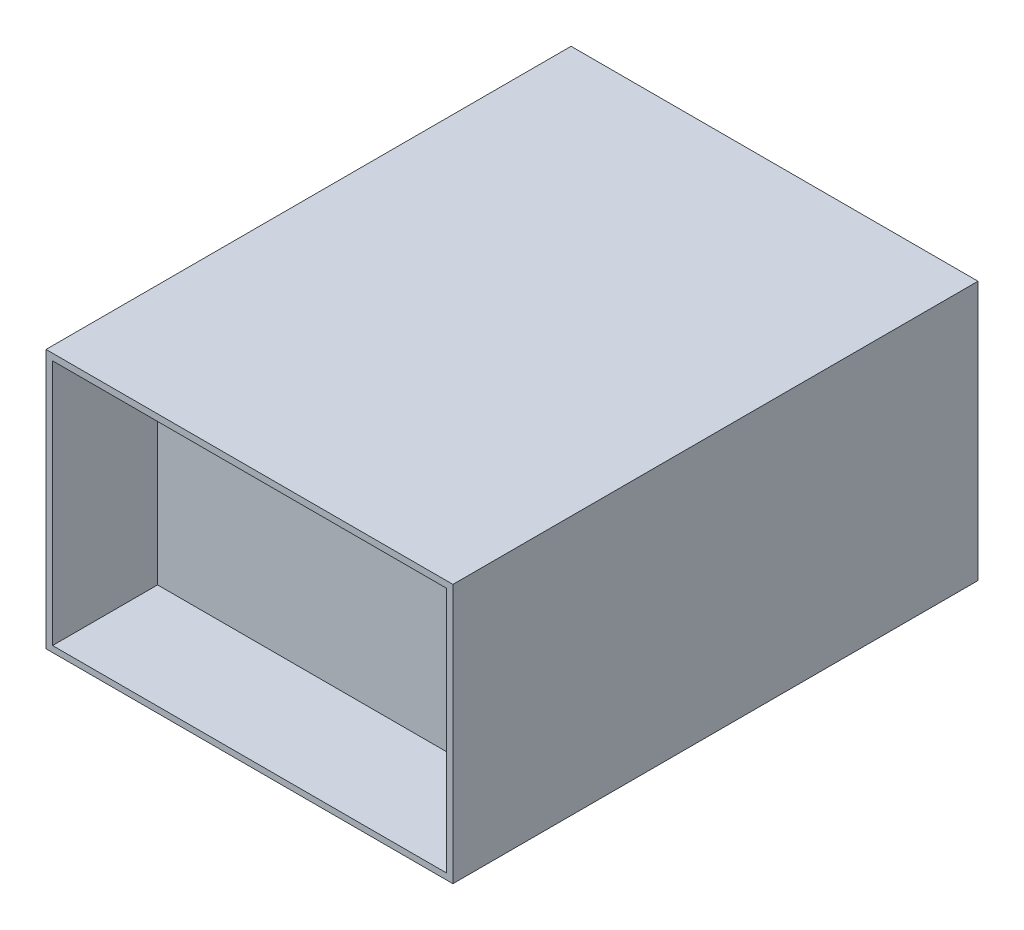
ISO-10303-21;
HEADER;
FILE_DESCRIPTION(('STEP AP214'),'2;1');
FILE_NAME('part.step','',(''),(''),'','','');
FILE_SCHEMA(('AUTOMOTIVE_DESIGN { 1 0 10303 214 1 1 1 1 }'));
ENDSEC;
DATA;
#1=APPLICATION_CONTEXT('core data for automotive mechanical design processes');
#2=APPLICATION_PROTOCOL_DEFINITION('international standard','automotive_design',2000,#1);
#3=PRODUCT_CONTEXT('',#1,'mechanical');
#4=PRODUCT('Part','Part','',(#3));
#5=PRODUCT_RELATED_PRODUCT_CATEGORY('part','',(#4));
#6=PRODUCT_DEFINITION_FORMATION('','',#4);
#7=PRODUCT_DEFINITION_CONTEXT('part definition',#1,'design');
#8=PRODUCT_DEFINITION('design','',#6,#7);
#9=PRODUCT_DEFINITION_SHAPE('','',#8);
#10=(LENGTH_UNIT() NAMED_UNIT(*) SI_UNIT(.MILLI.,.METRE.));
#11=(NAMED_UNIT(*) PLANE_ANGLE_UNIT() SI_UNIT($,.RADIAN.));
#12=(NAMED_UNIT(*) SI_UNIT($,.STERADIAN.) SOLID_ANGLE_UNIT());
#13=UNCERTAINTY_MEASURE_WITH_UNIT(LENGTH_MEASURE(1.E-05),#10,'distance_accuracy_value','');
#14=(GEOMETRIC_REPRESENTATION_CONTEXT(3) GLOBAL_UNCERTAINTY_ASSIGNED_CONTEXT((#13)) GLOBAL_UNIT_ASSIGNED_CONTEXT((#10,
#11,#12)) REPRESENTATION_CONTEXT('',''));
#15=CARTESIAN_POINT('',(0.,0.,0.));
#16=DIRECTION('',(0.,0.,1.));
#17=DIRECTION('',(1.,0.,0.));
#18=AXIS2_PLACEMENT_3D('',#15,#16,#17);
#19=CARTESIAN_POINT('',(0.,0.,0.));
#20=DIRECTION('',(0.,0.,1.));
#21=DIRECTION('',(1.,0.,0.));
#22=AXIS2_PLACEMENT_3D('',#19,#20,#21);
#23=PLANE('',#22);
#24=DIRECTION('',(-1.,0.,0.));
#25=VECTOR('',#24,1.);
#26=CARTESIAN_POINT('',(2500.,1675.,0.));
#27=LINE('',#26,#25);
#28=CARTESIAN_POINT('',(2500.,1675.,0.));
#29=VERTEX_POINT('',#28);
#30=CARTESIAN_POINT('',(-2500.,1675.,0.));
#31=VERTEX_POINT('',#30);
#32=EDGE_CURVE('E251',#29,#31,#27,.T.);
#33=ORIENTED_EDGE('',*,*,#32,.F.);
#34=DIRECTION('',(0.,-1.,0.));
#35=VECTOR('',#34,1.);
#36=CARTESIAN_POINT('',(2500.,1875.,0.));
#37=LINE('',#36,#35);
#38=CARTESIAN_POINT('',(2500.,1875.,0.));
#39=VERTEX_POINT('',#38);
#40=EDGE_CURVE('E246',#39,#29,#37,.T.);
#41=ORIENTED_EDGE('',*,*,#40,.F.);
#42=DIRECTION('',(1.,0.,0.));
#43=VECTOR('',#42,1.);
#44=CARTESIAN_POINT('',(2500.,1875.,0.));
#45=LINE('',#44,#43);
#46=CARTESIAN_POINT('',(-2500.,1875.,0.));
#47=VERTEX_POINT('',#46);
#48=EDGE_CURVE('E249',#47,#39,#45,.T.);
#49=ORIENTED_EDGE('',*,*,#48,.F.);
#50=DIRECTION('',(0.,1.,0.));
#51=VECTOR('',#50,1.);
#52=CARTESIAN_POINT('',(-2500.,1875.,0.));
#53=LINE('',#52,#51);
#54=EDGE_CURVE('E253',#31,#47,#53,.T.);
#55=ORIENTED_EDGE('',*,*,#54,.F.);
#56=EDGE_LOOP('',(#33,#41,#49,#55));
#57=FACE_BOUND('',#56,.T.);
#58=DIRECTION('',(0.,1.,0.));
#59=VECTOR('',#58,1.);
#60=CARTESIAN_POINT('',(3000.,-1875.,0.));
#61=LINE('',#60,#59);
#62=CARTESIAN_POINT('',(3000.,-1875.,0.));
#63=VERTEX_POINT('',#62);
#64=CARTESIAN_POINT('',(3000.,1875.,0.));
#65=VERTEX_POINT('',#64);
#66=EDGE_CURVE('E283',#63,#65,#61,.T.);
#67=ORIENTED_EDGE('',*,*,#66,.T.);
#68=DIRECTION('',(-1.,0.,0.));
#69=VECTOR('',#68,1.);
#70=CARTESIAN_POINT('',(3000.,1875.,0.));
#71=LINE('',#70,#69);
#72=CARTESIAN_POINT('',(2550.,1875.,0.));
#73=VERTEX_POINT('',#72);
#74=EDGE_CURVE('E318',#65,#73,#71,.T.);
#75=ORIENTED_EDGE('',*,*,#74,.T.);
#76=DIRECTION('',(0.,1.,0.));
#77=VECTOR('',#76,1.);
#78=CARTESIAN_POINT('',(2550.,-1875.,0.));
#79=LINE('',#78,#77);
#80=CARTESIAN_POINT('',(2550.,-1875.,0.));
#81=VERTEX_POINT('',#80);
#82=EDGE_CURVE('E314',#81,#73,#79,.T.);
#83=ORIENTED_EDGE('',*,*,#82,.F.);
#84=DIRECTION('',(-1.,0.,0.));
#85=VECTOR('',#84,1.);
#86=CARTESIAN_POINT('',(3000.,-1875.,0.));
#87=LINE('',#86,#85);
#88=EDGE_CURVE('E311',#63,#81,#87,.T.);
#89=ORIENTED_EDGE('',*,*,#88,.F.);
#90=EDGE_LOOP('',(#67,#75,#83,#89));
#91=FACE_BOUND('',#90,.T.);
#92=DIRECTION('',(0.,-1.,0.));
#93=VECTOR('',#92,1.);
#94=CARTESIAN_POINT('',(-3100.,-1975.,0.));
#95=LINE('',#94,#93);
#96=CARTESIAN_POINT('',(-3100.,1975.,0.));
#97=VERTEX_POINT('',#96);
#98=CARTESIAN_POINT('',(-3100.,-1975.,0.));
#99=VERTEX_POINT('',#98);
#100=EDGE_CURVE('E362',#97,#99,#95,.T.);
#101=ORIENTED_EDGE('',*,*,#100,.F.);
#102=DIRECTION('',(-1.,0.,0.));
#103=VECTOR('',#102,1.);
#104=CARTESIAN_POINT('',(3100.,1975.,0.));
#105=LINE('',#104,#103);
#106=CARTESIAN_POINT('',(3100.,1975.,0.));
#107=VERTEX_POINT('',#106);
#108=EDGE_CURVE('E367',#107,#97,#105,.T.);
#109=ORIENTED_EDGE('',*,*,#108,.F.);
#110=DIRECTION('',(0.,1.,0.));
#111=VECTOR('',#110,1.);
#112=CARTESIAN_POINT('',(3100.,-1975.,0.));
#113=LINE('',#112,#111);
#114=CARTESIAN_POINT('',(3100.,-1975.,0.));
#115=VERTEX_POINT('',#114);
#116=EDGE_CURVE('E378',#115,#107,#113,.T.);
#117=ORIENTED_EDGE('',*,*,#116,.F.);
#118=DIRECTION('',(1.,0.,0.));
#119=VECTOR('',#118,1.);
#120=CARTESIAN_POINT('',(3100.,-1975.,0.));
#121=LINE('',#120,#119);
#122=EDGE_CURVE('E376',#99,#115,#121,.T.);
#123=ORIENTED_EDGE('',*,*,#122,.F.);
#124=EDGE_LOOP('',(#101,#109,#117,#123));
#125=FACE_BOUND('',#124,.T.);
#126=DIRECTION('',(0.,-1.,0.));
#127=VECTOR('',#126,1.);
#128=CARTESIAN_POINT('',(-2500.,-1875.,0.));
#129=LINE('',#128,#127);
#130=CARTESIAN_POINT('',(-2500.,1625.,0.));
#131=VERTEX_POINT('',#130);
#132=CARTESIAN_POINT('',(-2500.,-1875.,0.));
#133=VERTEX_POINT('',#132);
#134=EDGE_CURVE('E300',#131,#133,#129,.T.);
#135=ORIENTED_EDGE('',*,*,#134,.T.);
#136=DIRECTION('',(1.,0.,0.));
#137=VECTOR('',#136,1.);
#138=CARTESIAN_POINT('',(-2500.,-1875.,0.));
#139=LINE('',#138,#137);
#140=CARTESIAN_POINT('',(2500.,-1875.,0.));
#141=VERTEX_POINT('',#140);
#142=EDGE_CURVE('E345',#133,#141,#139,.T.);
#143=ORIENTED_EDGE('',*,*,#142,.T.);
#144=DIRECTION('',(0.,1.,0.));
#145=VECTOR('',#144,1.);
#146=CARTESIAN_POINT('',(2500.,-1875.,0.));
#147=LINE('',#146,#145);
#148=CARTESIAN_POINT('',(2500.,1625.,0.));
#149=VERTEX_POINT('',#148);
#150=EDGE_CURVE('E348',#141,#149,#147,.T.);
#151=ORIENTED_EDGE('',*,*,#150,.T.);
#152=DIRECTION('',(-1.,0.,0.));
#153=VECTOR('',#152,1.);
#154=CARTESIAN_POINT('',(-2500.,1625.,0.));
#155=LINE('',#154,#153);
#156=EDGE_CURVE('E336',#149,#131,#155,.T.);
#157=ORIENTED_EDGE('',*,*,#156,.T.);
#158=EDGE_LOOP('',(#135,#143,#151,#157));
#159=FACE_BOUND('',#158,.T.);
#160=DIRECTION('',(0.,1.,0.));
#161=VECTOR('',#160,1.);
#162=CARTESIAN_POINT('',(-2550.,-1882.08551102095,0.));
#163=LINE('',#162,#161);
#164=CARTESIAN_POINT('',(-2550.,-1882.08551102095,0.));
#165=VERTEX_POINT('',#164);
#166=CARTESIAN_POINT('',(-2550.,1867.91448897905,0.));
#167=VERTEX_POINT('',#166);
#168=EDGE_CURVE('E279',#165,#167,#163,.T.);
#169=ORIENTED_EDGE('',*,*,#168,.T.);
#170=DIRECTION('',(-1.,0.,0.));
#171=VECTOR('',#170,1.);
#172=CARTESIAN_POINT('',(-2550.,1867.91448897905,0.));
#173=LINE('',#172,#171);
#174=CARTESIAN_POINT('',(-3000.,1867.91448897905,0.));
#175=VERTEX_POINT('',#174);
#176=EDGE_CURVE('E282',#167,#175,#173,.T.);
#177=ORIENTED_EDGE('',*,*,#176,.T.);
#178=DIRECTION('',(0.,1.,0.));
#179=VECTOR('',#178,1.);
#180=CARTESIAN_POINT('',(-3000.,-1882.08551102095,0.));
#181=LINE('',#180,#179);
#182=CARTESIAN_POINT('',(-3000.,-1882.08551102095,0.));
#183=VERTEX_POINT('',#182);
#184=EDGE_CURVE('E286',#183,#175,#181,.T.);
#185=ORIENTED_EDGE('',*,*,#184,.F.);
#186=DIRECTION('',(-1.,0.,0.));
#187=VECTOR('',#186,1.);
#188=CARTESIAN_POINT('',(-2550.,-1882.08551102095,0.));
#189=LINE('',#188,#187);
#190=EDGE_CURVE('E270',#165,#183,#189,.T.);
#191=ORIENTED_EDGE('',*,*,#190,.F.);
#192=EDGE_LOOP('',(#169,#177,#185,#191));
#193=FACE_BOUND('',#192,.T.);
#194=ADVANCED_FACE('F40',(#57,#91,#125,#159,#193),#23,.F.);
#195=CARTESIAN_POINT('',(-3100.,-1975.,8000.));
#196=DIRECTION('',(1.,0.,0.));
#197=DIRECTION('',(0.,0.,-1.));
#198=AXIS2_PLACEMENT_3D('',#195,#196,#197);
#199=PLANE('',#198);
#200=ORIENTED_EDGE('',*,*,#100,.T.);
#201=DIRECTION('',(0.,0.,-1.));
#202=VECTOR('',#201,1.);
#203=CARTESIAN_POINT('',(-3100.,-1975.,8000.));
#204=LINE('',#203,#202);
#205=CARTESIAN_POINT('',(-3100.,-1975.,8000.));
#206=VERTEX_POINT('',#205);
#207=EDGE_CURVE('E48',#206,#99,#204,.T.);
#208=ORIENTED_EDGE('',*,*,#207,.F.);
#209=DIRECTION('',(0.,-1.,0.));
#210=VECTOR('',#209,1.);
#211=CARTESIAN_POINT('',(-3100.,-1975.,8000.));
#212=LINE('',#211,#210);
#213=CARTESIAN_POINT('',(-3100.,1975.,8000.));
#214=VERTEX_POINT('',#213);
#215=EDGE_CURVE('E363',#214,#206,#212,.T.);
#216=ORIENTED_EDGE('',*,*,#215,.F.);
#217=DIRECTION('',(0.,0.,-1.));
#218=VECTOR('',#217,1.);
#219=CARTESIAN_POINT('',(-3100.,1975.,8000.));
#220=LINE('',#219,#218);
#221=EDGE_CURVE('E373',#214,#97,#220,.T.);
#222=ORIENTED_EDGE('',*,*,#221,.T.);
#223=EDGE_LOOP('',(#200,#208,#216,#222));
#224=FACE_BOUND('',#223,.T.);
#225=ADVANCED_FACE('F42',(#224),#199,.F.);
#226=CARTESIAN_POINT('',(3100.,-1975.,8000.));
#227=DIRECTION('',(0.,1.,0.));
#228=DIRECTION('',(-1.,0.,0.));
#229=AXIS2_PLACEMENT_3D('',#226,#227,#228);
#230=PLANE('',#229);
#231=ORIENTED_EDGE('',*,*,#122,.T.);
#232=DIRECTION('',(0.,0.,-1.));
#233=VECTOR('',#232,1.);
#234=CARTESIAN_POINT('',(3100.,-1975.,8000.));
#235=LINE('',#234,#233);
#236=CARTESIAN_POINT('',(3100.,-1975.,8000.));
#237=VERTEX_POINT('',#236);
#238=EDGE_CURVE('E386',#237,#115,#235,.T.);
#239=ORIENTED_EDGE('',*,*,#238,.F.);
#240=DIRECTION('',(1.,0.,0.));
#241=VECTOR('',#240,1.);
#242=CARTESIAN_POINT('',(3100.,-1975.,8000.));
#243=LINE('',#242,#241);
#244=EDGE_CURVE('E366',#206,#237,#243,.T.);
#245=ORIENTED_EDGE('',*,*,#244,.F.);
#246=ORIENTED_EDGE('',*,*,#207,.T.);
#247=EDGE_LOOP('',(#231,#239,#245,#246));
#248=FACE_BOUND('',#247,.T.);
#249=ADVANCED_FACE('F391',(#248),#230,.F.);
#250=CARTESIAN_POINT('',(3100.,-1975.,8000.));
#251=DIRECTION('',(-1.,0.,0.));
#252=DIRECTION('',(0.,0.,1.));
#253=AXIS2_PLACEMENT_3D('',#250,#251,#252);
#254=PLANE('',#253);
#255=ORIENTED_EDGE('',*,*,#116,.T.);
#256=DIRECTION('',(0.,0.,-1.));
#257=VECTOR('',#256,1.);
#258=CARTESIAN_POINT('',(3100.,1975.,8000.));
#259=LINE('',#258,#257);
#260=CARTESIAN_POINT('',(3100.,1975.,8000.));
#261=VERTEX_POINT('',#260);
#262=EDGE_CURVE('E383',#261,#107,#259,.T.);
#263=ORIENTED_EDGE('',*,*,#262,.F.);
#264=DIRECTION('',(0.,1.,0.));
#265=VECTOR('',#264,1.);
#266=CARTESIAN_POINT('',(3100.,-1975.,8000.));
#267=LINE('',#266,#265);
#268=EDGE_CURVE('E369',#237,#261,#267,.T.);
#269=ORIENTED_EDGE('',*,*,#268,.F.);
#270=ORIENTED_EDGE('',*,*,#238,.T.);
#271=EDGE_LOOP('',(#255,#263,#269,#270));
#272=FACE_BOUND('',#271,.T.);
#273=ADVANCED_FACE('F403',(#272),#254,.F.);
#274=CARTESIAN_POINT('',(3100.,1975.,8000.));
#275=DIRECTION('',(0.,-1.,0.));
#276=DIRECTION('',(1.,0.,0.));
#277=AXIS2_PLACEMENT_3D('',#274,#275,#276);
#278=PLANE('',#277);
#279=ORIENTED_EDGE('',*,*,#108,.T.);
#280=ORIENTED_EDGE('',*,*,#221,.F.);
#281=DIRECTION('',(-1.,0.,0.));
#282=VECTOR('',#281,1.);
#283=CARTESIAN_POINT('',(3100.,1975.,8000.));
#284=LINE('',#283,#282);
#285=EDGE_CURVE('E371',#261,#214,#284,.T.);
#286=ORIENTED_EDGE('',*,*,#285,.F.);
#287=ORIENTED_EDGE('',*,*,#262,.T.);
#288=EDGE_LOOP('',(#279,#280,#286,#287));
#289=FACE_BOUND('',#288,.T.);
#290=ADVANCED_FACE('F407',(#289),#278,.F.);
#291=CARTESIAN_POINT('',(0.,0.,8000.));
#292=DIRECTION('',(0.,0.,1.));
#293=DIRECTION('',(1.,0.,0.));
#294=AXIS2_PLACEMENT_3D('',#291,#292,#293);
#295=PLANE('',#294);
#296=DIRECTION('',(0.,-1.,0.));
#297=VECTOR('',#296,1.);
#298=CARTESIAN_POINT('',(-3000.,-1882.08551102095,8000.));
#299=LINE('',#298,#297);
#300=CARTESIAN_POINT('',(-3000.,1875.,8000.));
#301=VERTEX_POINT('',#300);
#302=CARTESIAN_POINT('',(-3000.,-1882.08551102095,8000.));
#303=VERTEX_POINT('',#302);
#304=EDGE_CURVE('E208',#301,#303,#299,.T.);
#305=ORIENTED_EDGE('',*,*,#304,.F.);
#306=DIRECTION('',(1.,0.,0.));
#307=VECTOR('',#306,1.);
#308=CARTESIAN_POINT('',(2500.,1875.,8000.));
#309=LINE('',#308,#307);
#310=CARTESIAN_POINT('',(3000.,1875.,8000.));
#311=VERTEX_POINT('',#310);
#312=EDGE_CURVE('E247',#301,#311,#309,.T.);
#313=ORIENTED_EDGE('',*,*,#312,.T.);
#314=DIRECTION('',(0.,1.,0.));
#315=VECTOR('',#314,1.);
#316=CARTESIAN_POINT('',(3000.,-1882.08551102095,8000.));
#317=LINE('',#316,#315);
#318=CARTESIAN_POINT('',(3000.,-1882.08551102095,8000.));
#319=VERTEX_POINT('',#318);
#320=EDGE_CURVE('E226',#319,#311,#317,.T.);
#321=ORIENTED_EDGE('',*,*,#320,.F.);
#322=DIRECTION('',(1.,0.,0.));
#323=VECTOR('',#322,1.);
#324=CARTESIAN_POINT('',(-3000.,-1882.08551102095,8000.));
#325=LINE('',#324,#323);
#326=EDGE_CURVE('E229',#303,#319,#325,.T.);
#327=ORIENTED_EDGE('',*,*,#326,.F.);
#328=EDGE_LOOP('',(#305,#313,#321,#327));
#329=FACE_BOUND('',#328,.T.);
#330=ORIENTED_EDGE('',*,*,#215,.T.);
#331=ORIENTED_EDGE('',*,*,#244,.T.);
#332=ORIENTED_EDGE('',*,*,#268,.T.);
#333=ORIENTED_EDGE('',*,*,#285,.T.);
#334=EDGE_LOOP('',(#330,#331,#332,#333));
#335=FACE_BOUND('',#334,.T.);
#336=ADVANCED_FACE('F409',(#329,#335),#295,.T.);
#337=CARTESIAN_POINT('',(-2500.,-1875.,6200.));
#338=DIRECTION('',(1.,0.,0.));
#339=DIRECTION('',(0.,0.,-1.));
#340=AXIS2_PLACEMENT_3D('',#337,#338,#339);
#341=PLANE('',#340);
#342=ORIENTED_EDGE('',*,*,#134,.F.);
#343=DIRECTION('',(0.,0.,-1.));
#344=VECTOR('',#343,1.);
#345=CARTESIAN_POINT('',(-2500.,1625.,6200.));
#346=LINE('',#345,#344);
#347=CARTESIAN_POINT('',(-2500.,1625.,6200.));
#348=VERTEX_POINT('',#347);
#349=EDGE_CURVE('E342',#348,#131,#346,.T.);
#350=ORIENTED_EDGE('',*,*,#349,.F.);
#351=DIRECTION('',(0.,-1.,0.));
#352=VECTOR('',#351,1.);
#353=CARTESIAN_POINT('',(-2500.,-1875.,6200.));
#354=LINE('',#353,#352);
#355=CARTESIAN_POINT('',(-2500.,-1875.,6200.));
#356=VERTEX_POINT('',#355);
#357=EDGE_CURVE('E332',#348,#356,#354,.T.);
#358=ORIENTED_EDGE('',*,*,#357,.T.);
#359=DIRECTION('',(0.,0.,-1.));
#360=VECTOR('',#359,1.);
#361=CARTESIAN_POINT('',(-2500.,-1875.,6200.));
#362=LINE('',#361,#360);
#363=EDGE_CURVE('E359',#356,#133,#362,.T.);
#364=ORIENTED_EDGE('',*,*,#363,.T.);
#365=EDGE_LOOP('',(#342,#350,#358,#364));
#366=FACE_BOUND('',#365,.T.);
#367=ADVANCED_FACE('F411',(#366),#341,.T.);
#368=CARTESIAN_POINT('',(-2500.,-1875.,6200.));
#369=DIRECTION('',(0.,1.,0.));
#370=DIRECTION('',(0.,0.,1.));
#371=AXIS2_PLACEMENT_3D('',#368,#369,#370);
#372=PLANE('',#371);
#373=ORIENTED_EDGE('',*,*,#142,.F.);
#374=ORIENTED_EDGE('',*,*,#363,.F.);
#375=DIRECTION('',(1.,0.,0.));
#376=VECTOR('',#375,1.);
#377=CARTESIAN_POINT('',(-2500.,-1875.,6200.));
#378=LINE('',#377,#376);
#379=CARTESIAN_POINT('',(2500.,-1875.,6200.));
#380=VERTEX_POINT('',#379);
#381=EDGE_CURVE('E335',#356,#380,#378,.T.);
#382=ORIENTED_EDGE('',*,*,#381,.T.);
#383=DIRECTION('',(0.,0.,-1.));
#384=VECTOR('',#383,1.);
#385=CARTESIAN_POINT('',(2500.,-1875.,6200.));
#386=LINE('',#385,#384);
#387=EDGE_CURVE('E357',#380,#141,#386,.T.);
#388=ORIENTED_EDGE('',*,*,#387,.T.);
#389=EDGE_LOOP('',(#373,#374,#382,#388));
#390=FACE_BOUND('',#389,.T.);
#391=ADVANCED_FACE('F418',(#390),#372,.T.);
#392=CARTESIAN_POINT('',(2500.,-1875.,6200.));
#393=DIRECTION('',(-1.,0.,0.));
#394=DIRECTION('',(0.,0.,1.));
#395=AXIS2_PLACEMENT_3D('',#392,#393,#394);
#396=PLANE('',#395);
#397=ORIENTED_EDGE('',*,*,#150,.F.);
#398=ORIENTED_EDGE('',*,*,#387,.F.);
#399=DIRECTION('',(0.,1.,0.));
#400=VECTOR('',#399,1.);
#401=CARTESIAN_POINT('',(2500.,-1875.,6200.));
#402=LINE('',#401,#400);
#403=CARTESIAN_POINT('',(2500.,1625.,6200.));
#404=VERTEX_POINT('',#403);
#405=EDGE_CURVE('E338',#380,#404,#402,.T.);
#406=ORIENTED_EDGE('',*,*,#405,.T.);
#407=DIRECTION('',(0.,0.,-1.));
#408=VECTOR('',#407,1.);
#409=CARTESIAN_POINT('',(2500.,1625.,6200.));
#410=LINE('',#409,#408);
#411=EDGE_CURVE('E355',#404,#149,#410,.T.);
#412=ORIENTED_EDGE('',*,*,#411,.T.);
#413=EDGE_LOOP('',(#397,#398,#406,#412));
#414=FACE_BOUND('',#413,.T.);
#415=ADVANCED_FACE('F463',(#414),#396,.T.);
#416=CARTESIAN_POINT('',(-2500.,1625.,6200.));
#417=DIRECTION('',(0.,-1.,0.));
#418=DIRECTION('',(0.,0.,-1.));
#419=AXIS2_PLACEMENT_3D('',#416,#417,#418);
#420=PLANE('',#419);
#421=ORIENTED_EDGE('',*,*,#156,.F.);
#422=ORIENTED_EDGE('',*,*,#411,.F.);
#423=DIRECTION('',(-1.,0.,0.));
#424=VECTOR('',#423,1.);
#425=CARTESIAN_POINT('',(-2500.,1625.,6200.));
#426=LINE('',#425,#424);
#427=EDGE_CURVE('E340',#404,#348,#426,.T.);
#428=ORIENTED_EDGE('',*,*,#427,.T.);
#429=ORIENTED_EDGE('',*,*,#349,.T.);
#430=EDGE_LOOP('',(#421,#422,#428,#429));
#431=FACE_BOUND('',#430,.T.);
#432=ADVANCED_FACE('F474',(#431),#420,.T.);
#433=CARTESIAN_POINT('',(0.,0.,6200.));
#434=DIRECTION('',(0.,0.,-1.));
#435=DIRECTION('',(-1.,0.,0.));
#436=AXIS2_PLACEMENT_3D('',#433,#434,#435);
#437=PLANE('',#436);
#438=ORIENTED_EDGE('',*,*,#357,.F.);
#439=ORIENTED_EDGE('',*,*,#427,.F.);
#440=ORIENTED_EDGE('',*,*,#405,.F.);
#441=ORIENTED_EDGE('',*,*,#381,.F.);
#442=EDGE_LOOP('',(#438,#439,#440,#441));
#443=FACE_BOUND('',#442,.T.);
#444=ADVANCED_FACE('F485',(#443),#437,.T.);
#445=CARTESIAN_POINT('',(3000.,-1875.,6200.));
#446=DIRECTION('',(-1.,0.,0.));
#447=DIRECTION('',(0.,0.,1.));
#448=AXIS2_PLACEMENT_3D('',#445,#446,#447);
#449=PLANE('',#448);
#450=ORIENTED_EDGE('',*,*,#66,.F.);
#451=DIRECTION('',(0.,0.,-1.));
#452=VECTOR('',#451,1.);
#453=CARTESIAN_POINT('',(3000.,-1875.,6200.));
#454=LINE('',#453,#452);
#455=CARTESIAN_POINT('',(3000.,-1875.,6200.));
#456=VERTEX_POINT('',#455);
#457=EDGE_CURVE('E307',#456,#63,#454,.T.);
#458=ORIENTED_EDGE('',*,*,#457,.F.);
#459=DIRECTION('',(0.,1.,0.));
#460=VECTOR('',#459,1.);
#461=CARTESIAN_POINT('',(3000.,-1875.,6200.));
#462=LINE('',#461,#460);
#463=CARTESIAN_POINT('',(3000.,1875.,6200.));
#464=VERTEX_POINT('',#463);
#465=EDGE_CURVE('E315',#456,#464,#462,.T.);
#466=ORIENTED_EDGE('',*,*,#465,.T.);
#467=DIRECTION('',(0.,0.,-1.));
#468=VECTOR('',#467,1.);
#469=CARTESIAN_POINT('',(3000.,1875.,6200.));
#470=LINE('',#469,#468);
#471=EDGE_CURVE('E260',#464,#65,#470,.T.);
#472=ORIENTED_EDGE('',*,*,#471,.T.);
#473=EDGE_LOOP('',(#450,#458,#466,#472));
#474=FACE_BOUND('',#473,.T.);
#475=ADVANCED_FACE('F496',(#474),#449,.T.);
#476=CARTESIAN_POINT('',(3000.,1875.,6200.));
#477=DIRECTION('',(0.,-1.,0.));
#478=DIRECTION('',(0.,0.,-1.));
#479=AXIS2_PLACEMENT_3D('',#476,#477,#478);
#480=PLANE('',#479);
#481=ORIENTED_EDGE('',*,*,#74,.F.);
#482=ORIENTED_EDGE('',*,*,#471,.F.);
#483=DIRECTION('',(-1.,0.,0.));
#484=VECTOR('',#483,1.);
#485=CARTESIAN_POINT('',(3000.,1875.,6200.));
#486=LINE('',#485,#484);
#487=CARTESIAN_POINT('',(2550.,1875.,6200.));
#488=VERTEX_POINT('',#487);
#489=EDGE_CURVE('E328',#464,#488,#486,.T.);
#490=ORIENTED_EDGE('',*,*,#489,.T.);
#491=DIRECTION('',(0.,0.,-1.));
#492=VECTOR('',#491,1.);
#493=CARTESIAN_POINT('',(2550.,1875.,6200.));
#494=LINE('',#493,#492);
#495=EDGE_CURVE('E303',#488,#73,#494,.T.);
#496=ORIENTED_EDGE('',*,*,#495,.T.);
#497=EDGE_LOOP('',(#481,#482,#490,#496));
#498=FACE_BOUND('',#497,.T.);
#499=ADVANCED_FACE('F508',(#498),#480,.T.);
#500=CARTESIAN_POINT('',(2550.,-1875.,6200.));
#501=DIRECTION('',(-1.,0.,0.));
#502=DIRECTION('',(0.,0.,1.));
#503=AXIS2_PLACEMENT_3D('',#500,#501,#502);
#504=PLANE('',#503);
#505=ORIENTED_EDGE('',*,*,#82,.T.);
#506=ORIENTED_EDGE('',*,*,#495,.F.);
#507=DIRECTION('',(0.,1.,0.));
#508=VECTOR('',#507,1.);
#509=CARTESIAN_POINT('',(2550.,-1875.,6200.));
#510=LINE('',#509,#508);
#511=CARTESIAN_POINT('',(2550.,-1875.,6200.));
#512=VERTEX_POINT('',#511);
#513=EDGE_CURVE('E325',#512,#488,#510,.T.);
#514=ORIENTED_EDGE('',*,*,#513,.F.);
#515=DIRECTION('',(0.,0.,-1.));
#516=VECTOR('',#515,1.);
#517=CARTESIAN_POINT('',(2550.,-1875.,6200.));
#518=LINE('',#517,#516);
#519=EDGE_CURVE('E305',#512,#81,#518,.T.);
#520=ORIENTED_EDGE('',*,*,#519,.T.);
#521=EDGE_LOOP('',(#505,#506,#514,#520));
#522=FACE_BOUND('',#521,.T.);
#523=ADVANCED_FACE('F519',(#522),#504,.F.);
#524=CARTESIAN_POINT('',(3000.,-1875.,6200.));
#525=DIRECTION('',(0.,-1.,0.));
#526=DIRECTION('',(1.,0.,0.));
#527=AXIS2_PLACEMENT_3D('',#524,#525,#526);
#528=PLANE('',#527);
#529=ORIENTED_EDGE('',*,*,#88,.T.);
#530=ORIENTED_EDGE('',*,*,#519,.F.);
#531=DIRECTION('',(-1.,0.,0.));
#532=VECTOR('',#531,1.);
#533=CARTESIAN_POINT('',(3000.,-1875.,6200.));
#534=LINE('',#533,#532);
#535=EDGE_CURVE('E310',#456,#512,#534,.T.);
#536=ORIENTED_EDGE('',*,*,#535,.F.);
#537=ORIENTED_EDGE('',*,*,#457,.T.);
#538=EDGE_LOOP('',(#529,#530,#536,#537));
#539=FACE_BOUND('',#538,.T.);
#540=ADVANCED_FACE('F530',(#539),#528,.F.);
#541=CARTESIAN_POINT('',(0.,0.,6200.));
#542=DIRECTION('',(0.,0.,1.));
#543=DIRECTION('',(1.,0.,0.));
#544=AXIS2_PLACEMENT_3D('',#541,#542,#543);
#545=PLANE('',#544);
#546=ORIENTED_EDGE('',*,*,#465,.F.);
#547=ORIENTED_EDGE('',*,*,#535,.T.);
#548=ORIENTED_EDGE('',*,*,#513,.T.);
#549=ORIENTED_EDGE('',*,*,#489,.F.);
#550=EDGE_LOOP('',(#546,#547,#548,#549));
#551=FACE_BOUND('',#550,.T.);
#552=ADVANCED_FACE('F541',(#551),#545,.F.);
#553=CARTESIAN_POINT('',(-2550.,-1882.08551102095,6200.));
#554=DIRECTION('',(-1.,0.,0.));
#555=DIRECTION('',(0.,0.,1.));
#556=AXIS2_PLACEMENT_3D('',#553,#554,#555);
#557=PLANE('',#556);
#558=ORIENTED_EDGE('',*,*,#168,.F.);
#559=DIRECTION('',(0.,0.,-1.));
#560=VECTOR('',#559,1.);
#561=CARTESIAN_POINT('',(-2550.,-1882.08551102095,6200.));
#562=LINE('',#561,#560);
#563=CARTESIAN_POINT('',(-2550.,-1882.08551102095,6200.));
#564=VERTEX_POINT('',#563);
#565=EDGE_CURVE('E278',#564,#165,#562,.T.);
#566=ORIENTED_EDGE('',*,*,#565,.F.);
#567=DIRECTION('',(0.,1.,0.));
#568=VECTOR('',#567,1.);
#569=CARTESIAN_POINT('',(-2550.,-1882.08551102095,6200.));
#570=LINE('',#569,#568);
#571=CARTESIAN_POINT('',(-2550.,1867.91448897905,6200.));
#572=VERTEX_POINT('',#571);
#573=EDGE_CURVE('E266',#564,#572,#570,.T.);
#574=ORIENTED_EDGE('',*,*,#573,.T.);
#575=DIRECTION('',(0.,0.,-1.));
#576=VECTOR('',#575,1.);
#577=CARTESIAN_POINT('',(-2550.,1867.91448897905,6200.));
#578=LINE('',#577,#576);
#579=EDGE_CURVE('E297',#572,#167,#578,.T.);
#580=ORIENTED_EDGE('',*,*,#579,.T.);
#581=EDGE_LOOP('',(#558,#566,#574,#580));
#582=FACE_BOUND('',#581,.T.);
#583=ADVANCED_FACE('F552',(#582),#557,.T.);
#584=CARTESIAN_POINT('',(-2550.,1867.91448897905,6200.));
#585=DIRECTION('',(0.,-1.,0.));
#586=DIRECTION('',(0.,0.,-1.));
#587=AXIS2_PLACEMENT_3D('',#584,#585,#586);
#588=PLANE('',#587);
#589=ORIENTED_EDGE('',*,*,#176,.F.);
#590=ORIENTED_EDGE('',*,*,#579,.F.);
#591=DIRECTION('',(-1.,0.,0.));
#592=VECTOR('',#591,1.);
#593=CARTESIAN_POINT('',(-2550.,1867.91448897905,6200.));
#594=LINE('',#593,#592);
#595=CARTESIAN_POINT('',(-3000.,1867.91448897905,6200.));
#596=VERTEX_POINT('',#595);
#597=EDGE_CURVE('E269',#572,#596,#594,.T.);
#598=ORIENTED_EDGE('',*,*,#597,.T.);
#599=DIRECTION('',(0.,0.,-1.));
#600=VECTOR('',#599,1.);
#601=CARTESIAN_POINT('',(-3000.,1867.91448897905,6200.));
#602=LINE('',#601,#600);
#603=EDGE_CURVE('E295',#596,#175,#602,.T.);
#604=ORIENTED_EDGE('',*,*,#603,.T.);
#605=EDGE_LOOP('',(#589,#590,#598,#604));
#606=FACE_BOUND('',#605,.T.);
#607=ADVANCED_FACE('F563',(#606),#588,.T.);
#608=CARTESIAN_POINT('',(-3000.,-1882.08551102095,6200.));
#609=DIRECTION('',(-1.,0.,0.));
#610=DIRECTION('',(0.,0.,1.));
#611=AXIS2_PLACEMENT_3D('',#608,#609,#610);
#612=PLANE('',#611);
#613=ORIENTED_EDGE('',*,*,#184,.T.);
#614=ORIENTED_EDGE('',*,*,#603,.F.);
#615=DIRECTION('',(0.,1.,0.));
#616=VECTOR('',#615,1.);
#617=CARTESIAN_POINT('',(-3000.,-1882.08551102095,6200.));
#618=LINE('',#617,#616);
#619=CARTESIAN_POINT('',(-3000.,-1882.08551102095,6200.));
#620=VERTEX_POINT('',#619);
#621=EDGE_CURVE('E272',#620,#596,#618,.T.);
#622=ORIENTED_EDGE('',*,*,#621,.F.);
#623=DIRECTION('',(0.,0.,-1.));
#624=VECTOR('',#623,1.);
#625=CARTESIAN_POINT('',(-3000.,-1882.08551102095,6200.));
#626=LINE('',#625,#624);
#627=EDGE_CURVE('E293',#620,#183,#626,.T.);
#628=ORIENTED_EDGE('',*,*,#627,.T.);
#629=EDGE_LOOP('',(#613,#614,#622,#628));
#630=FACE_BOUND('',#629,.T.);
#631=ADVANCED_FACE('F574',(#630),#612,.F.);
#632=CARTESIAN_POINT('',(-2550.,-1882.08551102095,6200.));
#633=DIRECTION('',(0.,-1.,0.));
#634=DIRECTION('',(0.,0.,-1.));
#635=AXIS2_PLACEMENT_3D('',#632,#633,#634);
#636=PLANE('',#635);
#637=ORIENTED_EDGE('',*,*,#190,.T.);
#638=ORIENTED_EDGE('',*,*,#627,.F.);
#639=DIRECTION('',(-1.,0.,0.));
#640=VECTOR('',#639,1.);
#641=CARTESIAN_POINT('',(-2550.,-1882.08551102095,6200.));
#642=LINE('',#641,#640);
#643=EDGE_CURVE('E275',#564,#620,#642,.T.);
#644=ORIENTED_EDGE('',*,*,#643,.F.);
#645=ORIENTED_EDGE('',*,*,#565,.T.);
#646=EDGE_LOOP('',(#637,#638,#644,#645));
#647=FACE_BOUND('',#646,.T.);
#648=ADVANCED_FACE('F585',(#647),#636,.F.);
#649=CARTESIAN_POINT('',(0.,0.,6200.));
#650=DIRECTION('',(0.,0.,1.));
#651=DIRECTION('',(1.,0.,0.));
#652=AXIS2_PLACEMENT_3D('',#649,#650,#651);
#653=PLANE('',#652);
#654=ORIENTED_EDGE('',*,*,#573,.F.);
#655=ORIENTED_EDGE('',*,*,#643,.T.);
#656=ORIENTED_EDGE('',*,*,#621,.T.);
#657=ORIENTED_EDGE('',*,*,#597,.F.);
#658=EDGE_LOOP('',(#654,#655,#656,#657));
#659=FACE_BOUND('',#658,.T.);
#660=ADVANCED_FACE('F596',(#659),#653,.F.);
#661=CARTESIAN_POINT('',(2500.,1875.,8000.));
#662=DIRECTION('',(1.,0.,0.));
#663=DIRECTION('',(0.,1.,0.));
#664=AXIS2_PLACEMENT_3D('',#661,#662,#663);
#665=PLANE('',#664);
#666=DIRECTION('',(0.,0.,-1.));
#667=VECTOR('',#666,1.);
#668=CARTESIAN_POINT('',(2500.,1675.,8000.));
#669=LINE('',#668,#667);
#670=CARTESIAN_POINT('',(2500.,1675.,6400.));
#671=VERTEX_POINT('',#670);
#672=EDGE_CURVE('E61',#671,#29,#669,.T.);
#673=ORIENTED_EDGE('',*,*,#672,.F.);
#674=DIRECTION('',(0.,1.,0.));
#675=VECTOR('',#674,1.);
#676=CARTESIAN_POINT('',(2500.,1875.,6400.));
#677=LINE('',#676,#675);
#678=CARTESIAN_POINT('',(2500.,1875.,6400.));
#679=VERTEX_POINT('',#678);
#680=EDGE_CURVE('E55',#671,#679,#677,.T.);
#681=ORIENTED_EDGE('',*,*,#680,.T.);
#682=DIRECTION('',(0.,0.,-1.));
#683=VECTOR('',#682,1.);
#684=CARTESIAN_POINT('',(2500.,1875.,8000.));
#685=LINE('',#684,#683);
#686=EDGE_CURVE('E258',#679,#39,#685,.T.);
#687=ORIENTED_EDGE('',*,*,#686,.T.);
#688=ORIENTED_EDGE('',*,*,#40,.T.);
#689=EDGE_LOOP('',(#673,#681,#687,#688));
#690=FACE_BOUND('',#689,.T.);
#691=ADVANCED_FACE('F606',(#690),#665,.F.);
#692=CARTESIAN_POINT('',(2500.,1875.,8000.));
#693=DIRECTION('',(0.,1.,0.));
#694=DIRECTION('',(0.,0.,1.));
#695=AXIS2_PLACEMENT_3D('',#692,#693,#694);
#696=PLANE('',#695);
#697=ORIENTED_EDGE('',*,*,#686,.F.);
#698=DIRECTION('',(-1.,0.,0.));
#699=VECTOR('',#698,1.);
#700=CARTESIAN_POINT('',(-3000.,1875.,6400.));
#701=LINE('',#700,#699);
#702=CARTESIAN_POINT('',(3000.,1875.,6400.));
#703=VERTEX_POINT('',#702);
#704=EDGE_CURVE('E213',#703,#679,#701,.T.);
#705=ORIENTED_EDGE('',*,*,#704,.F.);
#706=DIRECTION('',(0.,0.,1.));
#707=VECTOR('',#706,1.);
#708=CARTESIAN_POINT('',(3000.,1875.,6400.));
#709=LINE('',#708,#707);
#710=EDGE_CURVE('E239',#703,#311,#709,.T.);
#711=ORIENTED_EDGE('',*,*,#710,.T.);
#712=ORIENTED_EDGE('',*,*,#312,.F.);
#713=DIRECTION('',(0.,0.,1.));
#714=VECTOR('',#713,1.);
#715=CARTESIAN_POINT('',(-3000.,1875.,6400.));
#716=LINE('',#715,#714);
#717=CARTESIAN_POINT('',(-3000.,1875.,6400.));
#718=VERTEX_POINT('',#717);
#719=EDGE_CURVE('E236',#718,#301,#716,.T.);
#720=ORIENTED_EDGE('',*,*,#719,.F.);
#721=CARTESIAN_POINT('',(-2500.,1875.,6400.));
#722=VERTEX_POINT('',#721);
#723=EDGE_CURVE('E224',#722,#718,#701,.T.);
#724=ORIENTED_EDGE('',*,*,#723,.F.);
#725=DIRECTION('',(0.,0.,-1.));
#726=VECTOR('',#725,1.);
#727=CARTESIAN_POINT('',(-2500.,1875.,8000.));
#728=LINE('',#727,#726);
#729=EDGE_CURVE('E261',#722,#47,#728,.T.);
#730=ORIENTED_EDGE('',*,*,#729,.T.);
#731=ORIENTED_EDGE('',*,*,#48,.T.);
#732=EDGE_LOOP('',(#697,#705,#711,#712,#720,#724,#730,#731));
#733=FACE_BOUND('',#732,.T.);
#734=ADVANCED_FACE('F625',(#733),#696,.F.);
#735=CARTESIAN_POINT('',(-2500.,1875.,8000.));
#736=DIRECTION('',(-1.,0.,0.));
#737=DIRECTION('',(0.,-1.,0.));
#738=AXIS2_PLACEMENT_3D('',#735,#736,#737);
#739=PLANE('',#738);
#740=ORIENTED_EDGE('',*,*,#729,.F.);
#741=DIRECTION('',(0.,-1.,0.));
#742=VECTOR('',#741,1.);
#743=CARTESIAN_POINT('',(-2500.,1875.,6400.));
#744=LINE('',#743,#742);
#745=CARTESIAN_POINT('',(-2500.,1675.,6400.));
#746=VERTEX_POINT('',#745);
#747=EDGE_CURVE('E238',#722,#746,#744,.T.);
#748=ORIENTED_EDGE('',*,*,#747,.T.);
#749=DIRECTION('',(0.,0.,-1.));
#750=VECTOR('',#749,1.);
#751=CARTESIAN_POINT('',(-2500.,1675.,8000.));
#752=LINE('',#751,#750);
#753=EDGE_CURVE('E263',#746,#31,#752,.T.);
#754=ORIENTED_EDGE('',*,*,#753,.T.);
#755=ORIENTED_EDGE('',*,*,#54,.T.);
#756=EDGE_LOOP('',(#740,#748,#754,#755));
#757=FACE_BOUND('',#756,.T.);
#758=ADVANCED_FACE('F637',(#757),#739,.F.);
#759=CARTESIAN_POINT('',(2500.,1675.,8000.));
#760=DIRECTION('',(0.,-1.,0.));
#761=DIRECTION('',(0.,0.,-1.));
#762=AXIS2_PLACEMENT_3D('',#759,#760,#761);
#763=PLANE('',#762);
#764=ORIENTED_EDGE('',*,*,#753,.F.);
#765=DIRECTION('',(1.,0.,0.));
#766=VECTOR('',#765,1.);
#767=CARTESIAN_POINT('',(2500.,1675.,6400.));
#768=LINE('',#767,#766);
#769=EDGE_CURVE('E11',#746,#671,#768,.T.);
#770=ORIENTED_EDGE('',*,*,#769,.T.);
#771=ORIENTED_EDGE('',*,*,#672,.T.);
#772=ORIENTED_EDGE('',*,*,#32,.T.);
#773=EDGE_LOOP('',(#764,#770,#771,#772));
#774=FACE_BOUND('',#773,.T.);
#775=ADVANCED_FACE('F649',(#774),#763,.F.);
#776=CARTESIAN_POINT('',(0.,0.,6400.));
#777=DIRECTION('',(0.,0.,-1.));
#778=DIRECTION('',(-1.,0.,0.));
#779=AXIS2_PLACEMENT_3D('',#776,#777,#778);
#780=PLANE('',#779);
#781=ORIENTED_EDGE('',*,*,#769,.F.);
#782=ORIENTED_EDGE('',*,*,#747,.F.);
#783=ORIENTED_EDGE('',*,*,#723,.T.);
#784=DIRECTION('',(0.,-1.,0.));
#785=VECTOR('',#784,1.);
#786=CARTESIAN_POINT('',(-3000.,-1882.08551102095,6400.));
#787=LINE('',#786,#785);
#788=CARTESIAN_POINT('',(-3000.,-1882.08551102095,6400.));
#789=VERTEX_POINT('',#788);
#790=EDGE_CURVE('E206',#718,#789,#787,.T.);
#791=ORIENTED_EDGE('',*,*,#790,.T.);
#792=DIRECTION('',(1.,0.,0.));
#793=VECTOR('',#792,1.);
#794=CARTESIAN_POINT('',(-3000.,-1882.08551102095,6400.));
#795=LINE('',#794,#793);
#796=CARTESIAN_POINT('',(3000.,-1882.08551102095,6400.));
#797=VERTEX_POINT('',#796);
#798=EDGE_CURVE('E216',#789,#797,#795,.T.);
#799=ORIENTED_EDGE('',*,*,#798,.T.);
#800=DIRECTION('',(0.,1.,0.));
#801=VECTOR('',#800,1.);
#802=CARTESIAN_POINT('',(3000.,-1882.08551102095,6400.));
#803=LINE('',#802,#801);
#804=EDGE_CURVE('E220',#797,#703,#803,.T.);
#805=ORIENTED_EDGE('',*,*,#804,.T.);
#806=ORIENTED_EDGE('',*,*,#704,.T.);
#807=ORIENTED_EDGE('',*,*,#680,.F.);
#808=EDGE_LOOP('',(#781,#782,#783,#791,#799,#805,#806,#807));
#809=FACE_BOUND('',#808,.T.);
#810=ADVANCED_FACE('F222',(#809),#780,.F.);
#811=CARTESIAN_POINT('',(-3000.,-1882.08551102095,6400.));
#812=DIRECTION('',(-1.,0.,0.));
#813=DIRECTION('',(0.,0.,1.));
#814=AXIS2_PLACEMENT_3D('',#811,#812,#813);
#815=PLANE('',#814);
#816=ORIENTED_EDGE('',*,*,#304,.T.);
#817=DIRECTION('',(0.,0.,1.));
#818=VECTOR('',#817,1.);
#819=CARTESIAN_POINT('',(-3000.,-1882.08551102095,6400.));
#820=LINE('',#819,#818);
#821=EDGE_CURVE('E201',#789,#303,#820,.T.);
#822=ORIENTED_EDGE('',*,*,#821,.F.);
#823=ORIENTED_EDGE('',*,*,#790,.F.);
#824=ORIENTED_EDGE('',*,*,#719,.T.);
#825=EDGE_LOOP('',(#816,#822,#823,#824));
#826=FACE_BOUND('',#825,.T.);
#827=ADVANCED_FACE('F203',(#826),#815,.F.);
#828=CARTESIAN_POINT('',(3000.,-1882.08551102095,6400.));
#829=DIRECTION('',(1.,0.,0.));
#830=DIRECTION('',(0.,0.,-1.));
#831=AXIS2_PLACEMENT_3D('',#828,#829,#830);
#832=PLANE('',#831);
#833=ORIENTED_EDGE('',*,*,#320,.T.);
#834=ORIENTED_EDGE('',*,*,#710,.F.);
#835=ORIENTED_EDGE('',*,*,#804,.F.);
#836=DIRECTION('',(0.,0.,1.));
#837=VECTOR('',#836,1.);
#838=CARTESIAN_POINT('',(3000.,-1882.08551102095,6400.));
#839=LINE('',#838,#837);
#840=EDGE_CURVE('E212',#797,#319,#839,.T.);
#841=ORIENTED_EDGE('',*,*,#840,.T.);
#842=EDGE_LOOP('',(#833,#834,#835,#841));
#843=FACE_BOUND('',#842,.T.);
#844=ADVANCED_FACE('F676',(#843),#832,.F.);
#845=CARTESIAN_POINT('',(-3000.,-1882.08551102095,6400.));
#846=DIRECTION('',(0.,-1.,0.));
#847=DIRECTION('',(0.,0.,-1.));
#848=AXIS2_PLACEMENT_3D('',#845,#846,#847);
#849=PLANE('',#848);
#850=ORIENTED_EDGE('',*,*,#326,.T.);
#851=ORIENTED_EDGE('',*,*,#840,.F.);
#852=ORIENTED_EDGE('',*,*,#798,.F.);
#853=ORIENTED_EDGE('',*,*,#821,.T.);
#854=EDGE_LOOP('',(#850,#851,#852,#853));
#855=FACE_BOUND('',#854,.T.);
#856=ADVANCED_FACE('F217',(#855),#849,.F.);
#857=CLOSED_SHELL('',(#194,#225,#249,#273,#290,#336,#367,#391,#415,#432,#444,#475,#499,#523,
#540,#552,#583,#607,#631,#648,#660,#691,#734,#758,#775,#810,#827,#844,#856));
#858=MANIFOLD_SOLID_BREP('B2',#857);
#859=ADVANCED_BREP_SHAPE_REPRESENTATION('',(#18,#858),#14);
#860=SHAPE_DEFINITION_REPRESENTATION(#9,#859);
ENDSEC;
END-ISO-10303-21;
